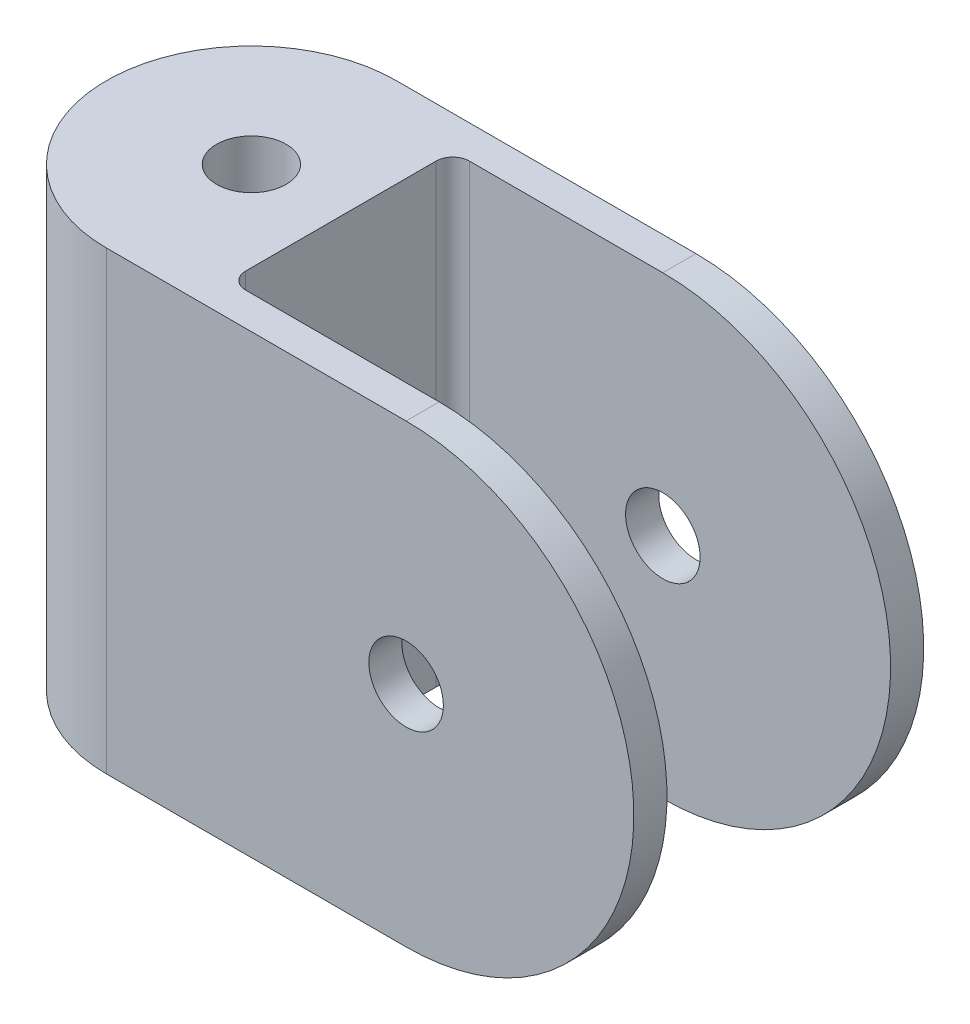
ISO-10303-21;
HEADER;
FILE_DESCRIPTION(('STEP AP214'),'2;1');
FILE_NAME('part.step','',(''),(''),'','','');
FILE_SCHEMA(('AUTOMOTIVE_DESIGN { 1 0 10303 214 1 1 1 1 }'));
ENDSEC;
DATA;
#1=APPLICATION_CONTEXT('core data for automotive mechanical design processes');
#2=APPLICATION_PROTOCOL_DEFINITION('international standard','automotive_design',2000,#1);
#3=PRODUCT_CONTEXT('',#1,'mechanical');
#4=PRODUCT('Part','Part','',(#3));
#5=PRODUCT_RELATED_PRODUCT_CATEGORY('part','',(#4));
#6=PRODUCT_DEFINITION_FORMATION('','',#4);
#7=PRODUCT_DEFINITION_CONTEXT('part definition',#1,'design');
#8=PRODUCT_DEFINITION('design','',#6,#7);
#9=PRODUCT_DEFINITION_SHAPE('','',#8);
#10=(LENGTH_UNIT() NAMED_UNIT(*) SI_UNIT(.MILLI.,.METRE.));
#11=(NAMED_UNIT(*) PLANE_ANGLE_UNIT() SI_UNIT($,.RADIAN.));
#12=(NAMED_UNIT(*) SI_UNIT($,.STERADIAN.) SOLID_ANGLE_UNIT());
#13=UNCERTAINTY_MEASURE_WITH_UNIT(LENGTH_MEASURE(1.E-05),#10,'distance_accuracy_value','');
#14=(GEOMETRIC_REPRESENTATION_CONTEXT(3) GLOBAL_UNCERTAINTY_ASSIGNED_CONTEXT((#13)) GLOBAL_UNIT_ASSIGNED_CONTEXT((#10,
#11,#12)) REPRESENTATION_CONTEXT('',''));
#15=CARTESIAN_POINT('',(0.,0.,0.));
#16=DIRECTION('',(0.,0.,1.));
#17=DIRECTION('',(1.,0.,0.));
#18=AXIS2_PLACEMENT_3D('',#15,#16,#17);
#19=CARTESIAN_POINT('',(20.,0.,17.5));
#20=DIRECTION('',(0.,1.,0.));
#21=DIRECTION('',(0.,0.,1.));
#22=AXIS2_PLACEMENT_3D('',#19,#20,#21);
#23=PLANE('',#22);
#24=DIRECTION('',(0.,0.,-1.));
#25=VECTOR('',#24,1.);
#26=CARTESIAN_POINT('',(-5.36809039854182,0.,-13.5));
#27=LINE('',#26,#25);
#28=CARTESIAN_POINT('',(-5.36809039854182,0.,11.5));
#29=VERTEX_POINT('',#28);
#30=CARTESIAN_POINT('',(-5.36809039854182,0.,-11.5));
#31=VERTEX_POINT('',#30);
#32=EDGE_CURVE('E155',#29,#31,#27,.T.);
#33=ORIENTED_EDGE('',*,*,#32,.F.);
#34=CARTESIAN_POINT('',(-3.36809039854182,0.,11.5));
#35=DIRECTION('',(0.,1.,0.));
#36=DIRECTION('',(0.,0.,1.));
#37=AXIS2_PLACEMENT_3D('',#34,#35,#36);
#38=CIRCLE('',#37,2.);
#39=CARTESIAN_POINT('',(-3.36809039854181,0.,13.5));
#40=VERTEX_POINT('',#39);
#41=EDGE_CURVE('E209',#29,#40,#38,.T.);
#42=ORIENTED_EDGE('',*,*,#41,.T.);
#43=DIRECTION('',(1.,0.,0.));
#44=VECTOR('',#43,1.);
#45=CARTESIAN_POINT('',(20.,0.,13.5));
#46=LINE('',#45,#44);
#47=CARTESIAN_POINT('',(20.,0.,13.5));
#48=VERTEX_POINT('',#47);
#49=EDGE_CURVE('E185',#40,#48,#46,.T.);
#50=ORIENTED_EDGE('',*,*,#49,.T.);
#51=DIRECTION('',(0.,0.,-1.));
#52=VECTOR('',#51,1.);
#53=CARTESIAN_POINT('',(20.,0.,17.5));
#54=LINE('',#53,#52);
#55=CARTESIAN_POINT('',(20.,0.,17.5));
#56=VERTEX_POINT('',#55);
#57=EDGE_CURVE('E193',#56,#48,#54,.T.);
#58=ORIENTED_EDGE('',*,*,#57,.F.);
#59=DIRECTION('',(1.,0.,0.));
#60=VECTOR('',#59,1.);
#61=CARTESIAN_POINT('',(20.,0.,17.5));
#62=LINE('',#61,#60);
#63=CARTESIAN_POINT('',(-16.1812820260358,0.,17.5));
#64=VERTEX_POINT('',#63);
#65=EDGE_CURVE('E176',#64,#56,#62,.T.);
#66=ORIENTED_EDGE('',*,*,#65,.F.);
#67=CARTESIAN_POINT('',(-16.1812820260358,0.,0.));
#68=DIRECTION('',(0.,1.,0.));
#69=DIRECTION('',(-1.,0.,0.));
#70=AXIS2_PLACEMENT_3D('',#67,#68,#69);
#71=CIRCLE('',#70,17.5);
#72=CARTESIAN_POINT('',(-16.1812820260358,0.,-17.5));
#73=VERTEX_POINT('',#72);
#74=EDGE_CURVE('E120',#73,#64,#71,.T.);
#75=ORIENTED_EDGE('',*,*,#74,.F.);
#76=DIRECTION('',(-1.,0.,0.));
#77=VECTOR('',#76,1.);
#78=CARTESIAN_POINT('',(0.,0.,-17.5));
#79=LINE('',#78,#77);
#80=CARTESIAN_POINT('',(20.,0.,-17.5));
#81=VERTEX_POINT('',#80);
#82=EDGE_CURVE('E113',#81,#73,#79,.T.);
#83=ORIENTED_EDGE('',*,*,#82,.F.);
#84=DIRECTION('',(0.,0.,1.));
#85=VECTOR('',#84,1.);
#86=CARTESIAN_POINT('',(20.,0.,-17.5));
#87=LINE('',#86,#85);
#88=CARTESIAN_POINT('',(20.,0.,-13.5));
#89=VERTEX_POINT('',#88);
#90=EDGE_CURVE('E117',#81,#89,#87,.T.);
#91=ORIENTED_EDGE('',*,*,#90,.T.);
#92=DIRECTION('',(1.,0.,0.));
#93=VECTOR('',#92,1.);
#94=CARTESIAN_POINT('',(0.,0.,-13.5));
#95=LINE('',#94,#93);
#96=CARTESIAN_POINT('',(-3.36809039854182,0.,-13.5));
#97=VERTEX_POINT('',#96);
#98=EDGE_CURVE('E158',#97,#89,#95,.T.);
#99=ORIENTED_EDGE('',*,*,#98,.F.);
#100=CARTESIAN_POINT('',(-3.36809039854182,0.,-11.5));
#101=DIRECTION('',(0.,1.,0.));
#102=DIRECTION('',(0.,0.,1.));
#103=AXIS2_PLACEMENT_3D('',#100,#101,#102);
#104=CIRCLE('',#103,2.);
#105=EDGE_CURVE('E11',#97,#31,#104,.T.);
#106=ORIENTED_EDGE('',*,*,#105,.T.);
#107=EDGE_LOOP('',(#33,#42,#50,#58,#66,#75,#83,#91,#99,#106));
#108=FACE_BOUND('',#107,.T.);
#109=CARTESIAN_POINT('',(-16.1812820260358,0.,0.));
#110=DIRECTION('',(0.,1.,0.));
#111=DIRECTION('',(-1.,0.,0.));
#112=AXIS2_PLACEMENT_3D('',#109,#110,#111);
#113=CIRCLE('',#112,4.19999999999999);
#114=CARTESIAN_POINT('',(-20.3812820260358,0.,0.));
#115=VERTEX_POINT('',#114);
#116=EDGE_CURVE('E149',#115,#115,#113,.T.);
#117=ORIENTED_EDGE('',*,*,#116,.T.);
#118=EDGE_LOOP('',(#117));
#119=FACE_BOUND('',#118,.T.);
#120=ADVANCED_FACE('F37',(#108,#119),#23,.F.);
#121=CARTESIAN_POINT('',(20.,27.5,17.5));
#122=DIRECTION('',(0.,0.,-1.));
#123=DIRECTION('',(-1.,0.,0.));
#124=AXIS2_PLACEMENT_3D('',#121,#122,#123);
#125=CYLINDRICAL_SURFACE('',#124,27.5);
#126=CARTESIAN_POINT('',(20.,27.5,13.5));
#127=DIRECTION('',(0.,0.,1.));
#128=DIRECTION('',(1.,0.,0.));
#129=AXIS2_PLACEMENT_3D('',#126,#127,#128);
#130=CIRCLE('',#129,27.5);
#131=CARTESIAN_POINT('',(20.,55.,13.5));
#132=VERTEX_POINT('',#131);
#133=EDGE_CURVE('E187',#48,#132,#130,.T.);
#134=ORIENTED_EDGE('',*,*,#133,.T.);
#135=DIRECTION('',(0.,0.,-1.));
#136=VECTOR('',#135,1.);
#137=CARTESIAN_POINT('',(20.,55.,17.5));
#138=LINE('',#137,#136);
#139=CARTESIAN_POINT('',(20.,55.,17.5));
#140=VERTEX_POINT('',#139);
#141=EDGE_CURVE('E184',#140,#132,#138,.T.);
#142=ORIENTED_EDGE('',*,*,#141,.F.);
#143=CARTESIAN_POINT('',(20.,27.5,17.5));
#144=DIRECTION('',(0.,0.,1.));
#145=DIRECTION('',(1.,0.,0.));
#146=AXIS2_PLACEMENT_3D('',#143,#144,#145);
#147=CIRCLE('',#146,27.5);
#148=EDGE_CURVE('E179',#56,#140,#147,.T.);
#149=ORIENTED_EDGE('',*,*,#148,.F.);
#150=ORIENTED_EDGE('',*,*,#57,.T.);
#151=EDGE_LOOP('',(#134,#142,#149,#150));
#152=FACE_BOUND('',#151,.T.);
#153=ADVANCED_FACE('F240',(#152),#125,.T.);
#154=CARTESIAN_POINT('',(0.,55.,17.5));
#155=DIRECTION('',(0.,-1.,0.));
#156=DIRECTION('',(0.,0.,-1.));
#157=AXIS2_PLACEMENT_3D('',#154,#155,#156);
#158=PLANE('',#157);
#159=DIRECTION('',(-1.,0.,0.));
#160=VECTOR('',#159,1.);
#161=CARTESIAN_POINT('',(0.,55.,13.5));
#162=LINE('',#161,#160);
#163=CARTESIAN_POINT('',(-3.36809039854184,55.,13.5));
#164=VERTEX_POINT('',#163);
#165=EDGE_CURVE('E180',#132,#164,#162,.T.);
#166=ORIENTED_EDGE('',*,*,#165,.T.);
#167=CARTESIAN_POINT('',(-3.36809039854184,55.,11.5));
#168=DIRECTION('',(0.,-1.,0.));
#169=DIRECTION('',(0.,0.,-1.));
#170=AXIS2_PLACEMENT_3D('',#167,#168,#169);
#171=CIRCLE('',#170,2.);
#172=CARTESIAN_POINT('',(-5.36809039854184,55.,11.5));
#173=VERTEX_POINT('',#172);
#174=EDGE_CURVE('E207',#164,#173,#171,.T.);
#175=ORIENTED_EDGE('',*,*,#174,.T.);
#176=DIRECTION('',(0.,0.,-1.));
#177=VECTOR('',#176,1.);
#178=CARTESIAN_POINT('',(-5.36809039854184,55.,-13.5));
#179=LINE('',#178,#177);
#180=CARTESIAN_POINT('',(-5.36809039854184,55.,-11.5));
#181=VERTEX_POINT('',#180);
#182=EDGE_CURVE('E165',#173,#181,#179,.T.);
#183=ORIENTED_EDGE('',*,*,#182,.T.);
#184=CARTESIAN_POINT('',(-3.36809039854184,55.,-11.5));
#185=DIRECTION('',(0.,-1.,0.));
#186=DIRECTION('',(0.,0.,-1.));
#187=AXIS2_PLACEMENT_3D('',#184,#185,#186);
#188=CIRCLE('',#187,2.);
#189=CARTESIAN_POINT('',(-3.36809039854184,55.,-13.5));
#190=VERTEX_POINT('',#189);
#191=EDGE_CURVE('E45',#181,#190,#188,.T.);
#192=ORIENTED_EDGE('',*,*,#191,.T.);
#193=DIRECTION('',(1.,0.,0.));
#194=VECTOR('',#193,1.);
#195=CARTESIAN_POINT('',(0.,55.,-13.5));
#196=LINE('',#195,#194);
#197=CARTESIAN_POINT('',(20.,55.,-13.5));
#198=VERTEX_POINT('',#197);
#199=EDGE_CURVE('E123',#190,#198,#196,.T.);
#200=ORIENTED_EDGE('',*,*,#199,.T.);
#201=DIRECTION('',(0.,0.,1.));
#202=VECTOR('',#201,1.);
#203=CARTESIAN_POINT('',(20.,55.,-17.5));
#204=LINE('',#203,#202);
#205=CARTESIAN_POINT('',(20.,55.,-17.5));
#206=VERTEX_POINT('',#205);
#207=EDGE_CURVE('E132',#206,#198,#204,.T.);
#208=ORIENTED_EDGE('',*,*,#207,.F.);
#209=DIRECTION('',(-1.,0.,0.));
#210=VECTOR('',#209,1.);
#211=CARTESIAN_POINT('',(0.,55.,-17.5));
#212=LINE('',#211,#210);
#213=CARTESIAN_POINT('',(-16.1812820260359,55.,-17.5));
#214=VERTEX_POINT('',#213);
#215=EDGE_CURVE('E137',#206,#214,#212,.T.);
#216=ORIENTED_EDGE('',*,*,#215,.T.);
#217=CARTESIAN_POINT('',(-16.1812820260359,55.,0.));
#218=DIRECTION('',(0.,1.,0.));
#219=DIRECTION('',(-1.,0.,0.));
#220=AXIS2_PLACEMENT_3D('',#217,#218,#219);
#221=CIRCLE('',#220,17.5);
#222=CARTESIAN_POINT('',(-16.1812820260359,55.,17.5));
#223=VERTEX_POINT('',#222);
#224=EDGE_CURVE('E162',#214,#223,#221,.T.);
#225=ORIENTED_EDGE('',*,*,#224,.T.);
#226=DIRECTION('',(-1.,0.,0.));
#227=VECTOR('',#226,1.);
#228=CARTESIAN_POINT('',(0.,55.,17.5));
#229=LINE('',#228,#227);
#230=EDGE_CURVE('E182',#140,#223,#229,.T.);
#231=ORIENTED_EDGE('',*,*,#230,.F.);
#232=ORIENTED_EDGE('',*,*,#141,.T.);
#233=EDGE_LOOP('',(#166,#175,#183,#192,#200,#208,#216,#225,#231,#232));
#234=FACE_BOUND('',#233,.T.);
#235=CARTESIAN_POINT('',(-16.1812820260359,55.,0.));
#236=DIRECTION('',(0.,1.,0.));
#237=DIRECTION('',(-1.,0.,0.));
#238=AXIS2_PLACEMENT_3D('',#235,#236,#237);
#239=CIRCLE('',#238,4.19999999999999);
#240=CARTESIAN_POINT('',(-20.3812820260358,55.,0.));
#241=VERTEX_POINT('',#240);
#242=EDGE_CURVE('E145',#241,#241,#239,.T.);
#243=ORIENTED_EDGE('',*,*,#242,.F.);
#244=EDGE_LOOP('',(#243));
#245=FACE_BOUND('',#244,.T.);
#246=ADVANCED_FACE('F222',(#234,#245),#158,.F.);
#247=CARTESIAN_POINT('',(20.,27.5,17.5));
#248=DIRECTION('',(0.,0.,1.));
#249=DIRECTION('',(1.,0.,0.));
#250=AXIS2_PLACEMENT_3D('',#247,#248,#249);
#251=PLANE('',#250);
#252=CARTESIAN_POINT('',(20.,27.5,17.5));
#253=DIRECTION('',(0.,0.,1.));
#254=DIRECTION('',(1.,0.,0.));
#255=AXIS2_PLACEMENT_3D('',#252,#253,#254);
#256=CIRCLE('',#255,4.5);
#257=CARTESIAN_POINT('',(24.5,27.5,17.5));
#258=VERTEX_POINT('',#257);
#259=EDGE_CURVE('E171',#258,#258,#256,.T.);
#260=ORIENTED_EDGE('',*,*,#259,.F.);
#261=EDGE_LOOP('',(#260));
#262=FACE_BOUND('',#261,.T.);
#263=ORIENTED_EDGE('',*,*,#65,.T.);
#264=ORIENTED_EDGE('',*,*,#148,.T.);
#265=ORIENTED_EDGE('',*,*,#230,.T.);
#266=DIRECTION('',(0.,1.,0.));
#267=VECTOR('',#266,1.);
#268=CARTESIAN_POINT('',(-16.1812820260358,0.,17.5));
#269=LINE('',#268,#267);
#270=EDGE_CURVE('E168',#64,#223,#269,.T.);
#271=ORIENTED_EDGE('',*,*,#270,.F.);
#272=EDGE_LOOP('',(#263,#264,#265,#271));
#273=FACE_BOUND('',#272,.T.);
#274=ADVANCED_FACE('F237',(#262,#273),#251,.T.);
#275=CARTESIAN_POINT('',(20.,27.5,13.5));
#276=DIRECTION('',(0.,0.,1.));
#277=DIRECTION('',(1.,0.,0.));
#278=AXIS2_PLACEMENT_3D('',#275,#276,#277);
#279=PLANE('',#278);
#280=CARTESIAN_POINT('',(20.,27.5,13.5));
#281=DIRECTION('',(0.,0.,1.));
#282=DIRECTION('',(1.,0.,0.));
#283=AXIS2_PLACEMENT_3D('',#280,#281,#282);
#284=CIRCLE('',#283,4.5);
#285=CARTESIAN_POINT('',(24.5,27.5,13.5));
#286=VERTEX_POINT('',#285);
#287=EDGE_CURVE('E175',#286,#286,#284,.T.);
#288=ORIENTED_EDGE('',*,*,#287,.T.);
#289=EDGE_LOOP('',(#288));
#290=FACE_BOUND('',#289,.T.);
#291=ORIENTED_EDGE('',*,*,#49,.F.);
#292=DIRECTION('',(0.,1.,0.));
#293=VECTOR('',#292,1.);
#294=CARTESIAN_POINT('',(-3.36809039854183,27.5,13.5));
#295=LINE('',#294,#293);
#296=EDGE_CURVE('E196',#40,#164,#295,.T.);
#297=ORIENTED_EDGE('',*,*,#296,.T.);
#298=ORIENTED_EDGE('',*,*,#165,.F.);
#299=ORIENTED_EDGE('',*,*,#133,.F.);
#300=EDGE_LOOP('',(#291,#297,#298,#299));
#301=FACE_BOUND('',#300,.T.);
#302=ADVANCED_FACE('F218',(#290,#301),#279,.F.);
#303=CARTESIAN_POINT('',(20.,27.5,-17.5));
#304=DIRECTION('',(0.,0.,1.));
#305=DIRECTION('',(1.,0.,0.));
#306=AXIS2_PLACEMENT_3D('',#303,#304,#305);
#307=CYLINDRICAL_SURFACE('',#306,4.5);
#308=ORIENTED_EDGE('',*,*,#259,.T.);
#309=EDGE_LOOP('',(#308));
#310=FACE_BOUND('',#309,.T.);
#311=ORIENTED_EDGE('',*,*,#287,.F.);
#312=EDGE_LOOP('',(#311));
#313=FACE_BOUND('',#312,.T.);
#314=ADVANCED_FACE('F270',(#310,#313),#307,.F.);
#315=CARTESIAN_POINT('',(0.,0.,-13.5));
#316=DIRECTION('',(0.,0.,1.));
#317=DIRECTION('',(1.,0.,0.));
#318=AXIS2_PLACEMENT_3D('',#315,#316,#317);
#319=PLANE('',#318);
#320=ORIENTED_EDGE('',*,*,#199,.F.);
#321=DIRECTION('',(0.,1.,0.));
#322=VECTOR('',#321,1.);
#323=CARTESIAN_POINT('',(-3.36809039854182,0.,-13.5));
#324=LINE('',#323,#322);
#325=EDGE_CURVE('E52',#190,#97,#324,.F.);
#326=ORIENTED_EDGE('',*,*,#325,.T.);
#327=ORIENTED_EDGE('',*,*,#98,.T.);
#328=CARTESIAN_POINT('',(20.,27.5,-13.5));
#329=DIRECTION('',(0.,0.,1.));
#330=DIRECTION('',(1.,0.,0.));
#331=AXIS2_PLACEMENT_3D('',#328,#329,#330);
#332=CIRCLE('',#331,27.5);
#333=EDGE_CURVE('E131',#89,#198,#332,.T.);
#334=ORIENTED_EDGE('',*,*,#333,.T.);
#335=EDGE_LOOP('',(#320,#326,#327,#334));
#336=FACE_BOUND('',#335,.T.);
#337=CARTESIAN_POINT('',(20.,27.5,-13.5));
#338=DIRECTION('',(0.,0.,1.));
#339=DIRECTION('',(1.,0.,0.));
#340=AXIS2_PLACEMENT_3D('',#337,#338,#339);
#341=CIRCLE('',#340,4.5);
#342=CARTESIAN_POINT('',(24.5,27.5,-13.5));
#343=VERTEX_POINT('',#342);
#344=EDGE_CURVE('E140',#343,#343,#341,.T.);
#345=ORIENTED_EDGE('',*,*,#344,.F.);
#346=EDGE_LOOP('',(#345));
#347=FACE_BOUND('',#346,.T.);
#348=ADVANCED_FACE('F229',(#336,#347),#319,.T.);
#349=CARTESIAN_POINT('',(-5.36809039854182,0.,-13.5));
#350=DIRECTION('',(1.,0.,0.));
#351=DIRECTION('',(0.,1.,0.));
#352=AXIS2_PLACEMENT_3D('',#349,#350,#351);
#353=PLANE('',#352);
#354=ORIENTED_EDGE('',*,*,#182,.F.);
#355=DIRECTION('',(0.,1.,0.));
#356=VECTOR('',#355,1.);
#357=CARTESIAN_POINT('',(-5.36809039854182,0.,11.5));
#358=LINE('',#357,#356);
#359=EDGE_CURVE('E204',#173,#29,#358,.F.);
#360=ORIENTED_EDGE('',*,*,#359,.T.);
#361=ORIENTED_EDGE('',*,*,#32,.T.);
#362=DIRECTION('',(0.,1.,0.));
#363=VECTOR('',#362,1.);
#364=CARTESIAN_POINT('',(-5.36809039854184,55.,-11.5));
#365=LINE('',#364,#363);
#366=EDGE_CURVE('E201',#31,#181,#365,.T.);
#367=ORIENTED_EDGE('',*,*,#366,.T.);
#368=EDGE_LOOP('',(#354,#360,#361,#367));
#369=FACE_BOUND('',#368,.T.);
#370=ADVANCED_FACE('F225',(#369),#353,.T.);
#371=CARTESIAN_POINT('',(-16.1812820260358,0.,0.));
#372=DIRECTION('',(0.,1.,0.));
#373=DIRECTION('',(-1.,0.,0.));
#374=AXIS2_PLACEMENT_3D('',#371,#372,#373);
#375=CYLINDRICAL_SURFACE('',#374,17.5);
#376=ORIENTED_EDGE('',*,*,#224,.F.);
#377=DIRECTION('',(0.,1.,0.));
#378=VECTOR('',#377,1.);
#379=CARTESIAN_POINT('',(-16.1812820260358,0.,-17.5));
#380=LINE('',#379,#378);
#381=EDGE_CURVE('E160',#73,#214,#380,.T.);
#382=ORIENTED_EDGE('',*,*,#381,.F.);
#383=ORIENTED_EDGE('',*,*,#74,.T.);
#384=ORIENTED_EDGE('',*,*,#270,.T.);
#385=EDGE_LOOP('',(#376,#382,#383,#384));
#386=FACE_BOUND('',#385,.T.);
#387=ADVANCED_FACE('F234',(#386),#375,.T.);
#388=CARTESIAN_POINT('',(0.,0.,-17.5));
#389=DIRECTION('',(0.,0.,-1.));
#390=DIRECTION('',(-1.,0.,0.));
#391=AXIS2_PLACEMENT_3D('',#388,#389,#390);
#392=PLANE('',#391);
#393=ORIENTED_EDGE('',*,*,#215,.F.);
#394=CARTESIAN_POINT('',(20.,27.5,-17.5));
#395=DIRECTION('',(0.,0.,1.));
#396=DIRECTION('',(1.,0.,0.));
#397=AXIS2_PLACEMENT_3D('',#394,#395,#396);
#398=CIRCLE('',#397,27.5);
#399=EDGE_CURVE('E129',#81,#206,#398,.T.);
#400=ORIENTED_EDGE('',*,*,#399,.F.);
#401=ORIENTED_EDGE('',*,*,#82,.T.);
#402=ORIENTED_EDGE('',*,*,#381,.T.);
#403=EDGE_LOOP('',(#393,#400,#401,#402));
#404=FACE_BOUND('',#403,.T.);
#405=CARTESIAN_POINT('',(20.,27.5,-17.5));
#406=DIRECTION('',(0.,0.,1.));
#407=DIRECTION('',(1.,0.,0.));
#408=AXIS2_PLACEMENT_3D('',#405,#406,#407);
#409=CIRCLE('',#408,4.5);
#410=CARTESIAN_POINT('',(24.5,27.5,-17.5));
#411=VERTEX_POINT('',#410);
#412=EDGE_CURVE('E143',#411,#411,#409,.T.);
#413=ORIENTED_EDGE('',*,*,#412,.T.);
#414=EDGE_LOOP('',(#413));
#415=FACE_BOUND('',#414,.T.);
#416=ADVANCED_FACE('F134',(#404,#415),#392,.T.);
#417=CARTESIAN_POINT('',(-16.1812820260358,0.,0.));
#418=DIRECTION('',(0.,1.,0.));
#419=DIRECTION('',(-1.,0.,0.));
#420=AXIS2_PLACEMENT_3D('',#417,#418,#419);
#421=CYLINDRICAL_SURFACE('',#420,4.19999999999999);
#422=ORIENTED_EDGE('',*,*,#116,.F.);
#423=EDGE_LOOP('',(#422));
#424=FACE_BOUND('',#423,.T.);
#425=ORIENTED_EDGE('',*,*,#242,.T.);
#426=EDGE_LOOP('',(#425));
#427=FACE_BOUND('',#426,.T.);
#428=ADVANCED_FACE('F261',(#424,#427),#421,.F.);
#429=CARTESIAN_POINT('',(20.,27.5,-17.5));
#430=DIRECTION('',(0.,0.,1.));
#431=DIRECTION('',(1.,0.,0.));
#432=AXIS2_PLACEMENT_3D('',#429,#430,#431);
#433=CYLINDRICAL_SURFACE('',#432,27.5);
#434=ORIENTED_EDGE('',*,*,#333,.F.);
#435=ORIENTED_EDGE('',*,*,#90,.F.);
#436=ORIENTED_EDGE('',*,*,#399,.T.);
#437=ORIENTED_EDGE('',*,*,#207,.T.);
#438=EDGE_LOOP('',(#434,#435,#436,#437));
#439=FACE_BOUND('',#438,.T.);
#440=ADVANCED_FACE('F127',(#439),#433,.T.);
#441=CARTESIAN_POINT('',(20.,27.5,-17.5));
#442=DIRECTION('',(0.,0.,1.));
#443=DIRECTION('',(1.,0.,0.));
#444=AXIS2_PLACEMENT_3D('',#441,#442,#443);
#445=CYLINDRICAL_SURFACE('',#444,4.5);
#446=ORIENTED_EDGE('',*,*,#344,.T.);
#447=EDGE_LOOP('',(#446));
#448=FACE_BOUND('',#447,.T.);
#449=ORIENTED_EDGE('',*,*,#412,.F.);
#450=EDGE_LOOP('',(#449));
#451=FACE_BOUND('',#450,.T.);
#452=ADVANCED_FACE('F251',(#448,#451),#445,.F.);
#453=CARTESIAN_POINT('',(-3.36809039854183,27.5,11.5));
#454=DIRECTION('',(0.,1.,0.));
#455=DIRECTION('',(-1.,0.,0.));
#456=AXIS2_PLACEMENT_3D('',#453,#454,#455);
#457=CYLINDRICAL_SURFACE('',#456,2.);
#458=ORIENTED_EDGE('',*,*,#41,.F.);
#459=ORIENTED_EDGE('',*,*,#359,.F.);
#460=ORIENTED_EDGE('',*,*,#174,.F.);
#461=ORIENTED_EDGE('',*,*,#296,.F.);
#462=EDGE_LOOP('',(#458,#459,#460,#461));
#463=FACE_BOUND('',#462,.T.);
#464=ADVANCED_FACE('F220',(#463),#457,.F.);
#465=CARTESIAN_POINT('',(-3.36809039854182,0.,-11.5));
#466=DIRECTION('',(0.,-1.,0.));
#467=DIRECTION('',(1.,0.,0.));
#468=AXIS2_PLACEMENT_3D('',#465,#466,#467);
#469=CYLINDRICAL_SURFACE('',#468,2.);
#470=ORIENTED_EDGE('',*,*,#105,.F.);
#471=ORIENTED_EDGE('',*,*,#325,.F.);
#472=ORIENTED_EDGE('',*,*,#191,.F.);
#473=ORIENTED_EDGE('',*,*,#366,.F.);
#474=EDGE_LOOP('',(#470,#471,#472,#473));
#475=FACE_BOUND('',#474,.T.);
#476=ADVANCED_FACE('F39',(#475),#469,.F.);
#477=CLOSED_SHELL('',(#120,#153,#246,#274,#302,#314,#348,#370,#387,#416,#428,#440,#452,#464,#476));
#478=MANIFOLD_SOLID_BREP('B2',#477);
#479=ADVANCED_BREP_SHAPE_REPRESENTATION('',(#18,#478),#14);
#480=SHAPE_DEFINITION_REPRESENTATION(#9,#479);
ENDSEC;
END-ISO-10303-21;
